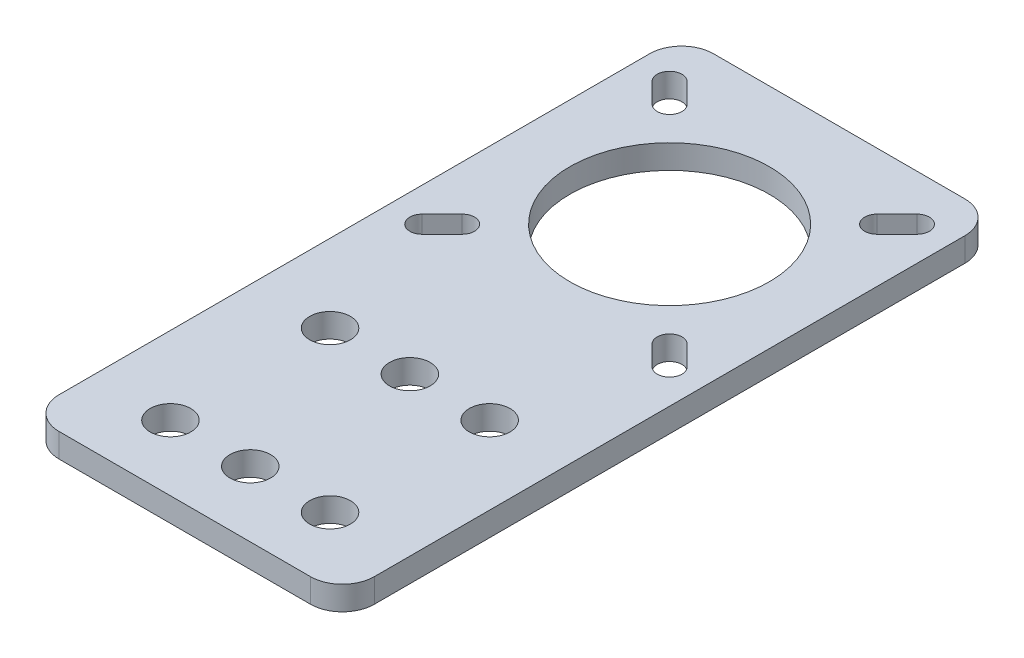
ISO-10303-21;
HEADER;
FILE_DESCRIPTION(('STEP AP214'),'2;1');
FILE_NAME('part.step','',(''),(''),'','','');
FILE_SCHEMA(('AUTOMOTIVE_DESIGN { 1 0 10303 214 1 1 1 1 }'));
ENDSEC;
DATA;
#1=APPLICATION_CONTEXT('core data for automotive mechanical design processes');
#2=APPLICATION_PROTOCOL_DEFINITION('international standard','automotive_design',2000,#1);
#3=PRODUCT_CONTEXT('',#1,'mechanical');
#4=PRODUCT('Part','Part','',(#3));
#5=PRODUCT_RELATED_PRODUCT_CATEGORY('part','',(#4));
#6=PRODUCT_DEFINITION_FORMATION('','',#4);
#7=PRODUCT_DEFINITION_CONTEXT('part definition',#1,'design');
#8=PRODUCT_DEFINITION('design','',#6,#7);
#9=PRODUCT_DEFINITION_SHAPE('','',#8);
#10=(LENGTH_UNIT() NAMED_UNIT(*) SI_UNIT(.MILLI.,.METRE.));
#11=(NAMED_UNIT(*) PLANE_ANGLE_UNIT() SI_UNIT($,.RADIAN.));
#12=(NAMED_UNIT(*) SI_UNIT($,.STERADIAN.) SOLID_ANGLE_UNIT());
#13=UNCERTAINTY_MEASURE_WITH_UNIT(LENGTH_MEASURE(1.E-05),#10,'distance_accuracy_value','');
#14=(GEOMETRIC_REPRESENTATION_CONTEXT(3) GLOBAL_UNCERTAINTY_ASSIGNED_CONTEXT((#13)) GLOBAL_UNIT_ASSIGNED_CONTEXT((#10,
#11,#12)) REPRESENTATION_CONTEXT('',''));
#15=CARTESIAN_POINT('',(0.,0.,0.));
#16=DIRECTION('',(0.,0.,1.));
#17=DIRECTION('',(1.,0.,0.));
#18=AXIS2_PLACEMENT_3D('',#15,#16,#17);
#19=CARTESIAN_POINT('',(0.,3.,0.));
#20=DIRECTION('',(0.,-1.,0.));
#21=DIRECTION('',(0.,0.,-1.));
#22=AXIS2_PLACEMENT_3D('',#19,#20,#21);
#23=PLANE('',#22);
#24=CARTESIAN_POINT('',(0.,3.,32.8));
#25=DIRECTION('',(0.,1.,0.));
#26=DIRECTION('',(0.,0.,1.));
#27=AXIS2_PLACEMENT_3D('',#24,#25,#26);
#28=CIRCLE('',#27,2.55);
#29=CARTESIAN_POINT('',(0.,3.,35.35));
#30=VERTEX_POINT('',#29);
#31=EDGE_CURVE('E376',#30,#30,#28,.T.);
#32=ORIENTED_EDGE('',*,*,#31,.F.);
#33=EDGE_LOOP('',(#32));
#34=FACE_BOUND('',#33,.T.);
#35=CARTESIAN_POINT('',(-10.,3.,32.8));
#36=DIRECTION('',(0.,1.,0.));
#37=DIRECTION('',(0.,0.,1.));
#38=AXIS2_PLACEMENT_3D('',#35,#36,#37);
#39=CIRCLE('',#38,2.55);
#40=CARTESIAN_POINT('',(-10.,3.,35.35));
#41=VERTEX_POINT('',#40);
#42=EDGE_CURVE('E370',#41,#41,#39,.T.);
#43=ORIENTED_EDGE('',*,*,#42,.F.);
#44=EDGE_LOOP('',(#43));
#45=FACE_BOUND('',#44,.T.);
#46=CARTESIAN_POINT('',(0.,3.,12.8));
#47=DIRECTION('',(0.,1.,0.));
#48=DIRECTION('',(0.,0.,1.));
#49=AXIS2_PLACEMENT_3D('',#46,#47,#48);
#50=CIRCLE('',#49,2.55);
#51=CARTESIAN_POINT('',(0.,3.,15.35));
#52=VERTEX_POINT('',#51);
#53=EDGE_CURVE('E357',#52,#52,#50,.T.);
#54=ORIENTED_EDGE('',*,*,#53,.F.);
#55=EDGE_LOOP('',(#54));
#56=FACE_BOUND('',#55,.T.);
#57=DIRECTION('',(0.707106781186547,0.,0.707106781186548));
#58=VECTOR('',#57,1.);
#59=CARTESIAN_POINT('',(8.77898448916083,3.,-8.77898448916081));
#60=LINE('',#59,#58);
#61=CARTESIAN_POINT('',(-16.5960155108391,3.,-34.1539844891608));
#62=VERTEX_POINT('',#61);
#63=CARTESIAN_POINT('',(-14.0960155108391,3.,-31.6539844891608));
#64=VERTEX_POINT('',#63);
#65=EDGE_CURVE('E438',#62,#64,#60,.T.);
#66=ORIENTED_EDGE('',*,*,#65,.F.);
#67=CARTESIAN_POINT('',(-15.5,3.,-35.25));
#68=DIRECTION('',(0.,1.,0.));
#69=DIRECTION('',(0.,0.,1.));
#70=AXIS2_PLACEMENT_3D('',#67,#68,#69);
#71=CIRCLE('',#70,1.55);
#72=CARTESIAN_POINT('',(-14.4039844891609,3.,-36.3460155108391));
#73=VERTEX_POINT('',#72);
#74=EDGE_CURVE('E441',#73,#62,#71,.T.);
#75=ORIENTED_EDGE('',*,*,#74,.F.);
#76=DIRECTION('',(0.707106781186547,0.,0.707106781186549));
#77=VECTOR('',#76,1.);
#78=CARTESIAN_POINT('',(10.9710155108391,3.,-10.9710155108391));
#79=LINE('',#78,#77);
#80=CARTESIAN_POINT('',(-11.9039844891609,3.,-33.8460155108391));
#81=VERTEX_POINT('',#80);
#82=EDGE_CURVE('E431',#73,#81,#79,.T.);
#83=ORIENTED_EDGE('',*,*,#82,.T.);
#84=CARTESIAN_POINT('',(-13.,3.,-32.75));
#85=DIRECTION('',(0.,1.,0.));
#86=DIRECTION('',(0.,0.,1.));
#87=AXIS2_PLACEMENT_3D('',#84,#85,#86);
#88=CIRCLE('',#87,1.55);
#89=EDGE_CURVE('E434',#64,#81,#88,.T.);
#90=ORIENTED_EDGE('',*,*,#89,.F.);
#91=EDGE_LOOP('',(#66,#75,#83,#90));
#92=FACE_BOUND('',#91,.T.);
#93=DIRECTION('',(0.707106781186548,0.,-0.707106781186548));
#94=VECTOR('',#93,1.);
#95=CARTESIAN_POINT('',(-8.77898448916085,3.,-8.77898448916085));
#96=LINE('',#95,#94);
#97=CARTESIAN_POINT('',(-14.4039844891608,3.,-3.15398448916087));
#98=VERTEX_POINT('',#97);
#99=CARTESIAN_POINT('',(-11.9039844891609,3.,-5.65398448916085));
#100=VERTEX_POINT('',#99);
#101=EDGE_CURVE('E469',#98,#100,#96,.T.);
#102=ORIENTED_EDGE('',*,*,#101,.F.);
#103=CARTESIAN_POINT('',(-15.5,3.,-4.25000000000001));
#104=DIRECTION('',(0.,1.,0.));
#105=DIRECTION('',(0.,0.,1.));
#106=AXIS2_PLACEMENT_3D('',#103,#104,#105);
#107=CIRCLE('',#106,1.55);
#108=CARTESIAN_POINT('',(-16.5960155108392,3.,-5.34601551083915));
#109=VERTEX_POINT('',#108);
#110=EDGE_CURVE('E430',#109,#98,#107,.T.);
#111=ORIENTED_EDGE('',*,*,#110,.F.);
#112=DIRECTION('',(0.707106781186548,0.,-0.707106781186547));
#113=VECTOR('',#112,1.);
#114=CARTESIAN_POINT('',(-10.9710155108392,3.,-10.9710155108392));
#115=LINE('',#114,#113);
#116=CARTESIAN_POINT('',(-14.0960155108392,3.,-7.84601551083915));
#117=VERTEX_POINT('',#116);
#118=EDGE_CURVE('E462',#109,#117,#115,.T.);
#119=ORIENTED_EDGE('',*,*,#118,.T.);
#120=CARTESIAN_POINT('',(-13.,3.,-6.75));
#121=DIRECTION('',(0.,1.,0.));
#122=DIRECTION('',(0.,0.,1.));
#123=AXIS2_PLACEMENT_3D('',#120,#121,#122);
#124=CIRCLE('',#123,1.55);
#125=EDGE_CURVE('E465',#100,#117,#124,.T.);
#126=ORIENTED_EDGE('',*,*,#125,.F.);
#127=EDGE_LOOP('',(#102,#111,#119,#126));
#128=FACE_BOUND('',#127,.T.);
#129=CARTESIAN_POINT('',(10.,3.,32.7999999999999));
#130=DIRECTION('',(0.,1.,0.));
#131=DIRECTION('',(0.,0.,1.));
#132=AXIS2_PLACEMENT_3D('',#129,#130,#131);
#133=CIRCLE('',#132,2.55);
#134=CARTESIAN_POINT('',(10.,3.,35.3499999999999));
#135=VERTEX_POINT('',#134);
#136=EDGE_CURVE('E382',#135,#135,#133,.F.);
#137=ORIENTED_EDGE('',*,*,#136,.T.);
#138=EDGE_LOOP('',(#137));
#139=FACE_BOUND('',#138,.T.);
#140=DIRECTION('',(0.,0.,1.));
#141=VECTOR('',#140,1.);
#142=CARTESIAN_POINT('',(-19.75,3.,41.));
#143=LINE('',#142,#141);
#144=CARTESIAN_POINT('',(-19.75,3.,-37.));
#145=VERTEX_POINT('',#144);
#146=CARTESIAN_POINT('',(-19.75,3.,37.));
#147=VERTEX_POINT('',#146);
#148=EDGE_CURVE('E493',#145,#147,#143,.T.);
#149=ORIENTED_EDGE('',*,*,#148,.T.);
#150=CARTESIAN_POINT('',(-15.75,3.,37.));
#151=DIRECTION('',(0.,-1.,0.));
#152=DIRECTION('',(0.,0.,-1.));
#153=AXIS2_PLACEMENT_3D('',#150,#151,#152);
#154=CIRCLE('',#153,4.);
#155=CARTESIAN_POINT('',(-15.75,3.,41.));
#156=VERTEX_POINT('',#155);
#157=EDGE_CURVE('E531',#147,#156,#154,.F.);
#158=ORIENTED_EDGE('',*,*,#157,.T.);
#159=DIRECTION('',(1.,0.,0.));
#160=VECTOR('',#159,1.);
#161=CARTESIAN_POINT('',(-19.75,3.,41.));
#162=LINE('',#161,#160);
#163=CARTESIAN_POINT('',(15.75,3.,41.));
#164=VERTEX_POINT('',#163);
#165=EDGE_CURVE('E496',#156,#164,#162,.T.);
#166=ORIENTED_EDGE('',*,*,#165,.T.);
#167=CARTESIAN_POINT('',(15.75,3.,37.));
#168=DIRECTION('',(0.,-1.,0.));
#169=DIRECTION('',(0.,0.,-1.));
#170=AXIS2_PLACEMENT_3D('',#167,#168,#169);
#171=CIRCLE('',#170,4.);
#172=CARTESIAN_POINT('',(19.75,3.,37.));
#173=VERTEX_POINT('',#172);
#174=EDGE_CURVE('E529',#164,#173,#171,.F.);
#175=ORIENTED_EDGE('',*,*,#174,.T.);
#176=DIRECTION('',(0.,0.,-1.));
#177=VECTOR('',#176,1.);
#178=CARTESIAN_POINT('',(19.75,3.,41.));
#179=LINE('',#178,#177);
#180=CARTESIAN_POINT('',(19.75,3.,-37.));
#181=VERTEX_POINT('',#180);
#182=EDGE_CURVE('E488',#173,#181,#179,.T.);
#183=ORIENTED_EDGE('',*,*,#182,.T.);
#184=CARTESIAN_POINT('',(15.75,3.,-37.));
#185=DIRECTION('',(0.,-1.,0.));
#186=DIRECTION('',(0.,0.,-1.));
#187=AXIS2_PLACEMENT_3D('',#184,#185,#186);
#188=CIRCLE('',#187,4.);
#189=CARTESIAN_POINT('',(15.75,3.,-41.));
#190=VERTEX_POINT('',#189);
#191=EDGE_CURVE('E175',#181,#190,#188,.F.);
#192=ORIENTED_EDGE('',*,*,#191,.T.);
#193=DIRECTION('',(-1.,0.,0.));
#194=VECTOR('',#193,1.);
#195=CARTESIAN_POINT('',(-19.75,3.,-41.));
#196=LINE('',#195,#194);
#197=CARTESIAN_POINT('',(-15.75,3.,-41.));
#198=VERTEX_POINT('',#197);
#199=EDGE_CURVE('E490',#190,#198,#196,.T.);
#200=ORIENTED_EDGE('',*,*,#199,.T.);
#201=CARTESIAN_POINT('',(-15.75,3.,-37.));
#202=DIRECTION('',(0.,-1.,0.));
#203=DIRECTION('',(0.,0.,-1.));
#204=AXIS2_PLACEMENT_3D('',#201,#202,#203);
#205=CIRCLE('',#204,4.);
#206=EDGE_CURVE('E527',#198,#145,#205,.F.);
#207=ORIENTED_EDGE('',*,*,#206,.T.);
#208=EDGE_LOOP('',(#149,#158,#166,#175,#183,#192,#200,#207));
#209=FACE_BOUND('',#208,.T.);
#210=CARTESIAN_POINT('',(0.,3.,-19.75));
#211=DIRECTION('',(0.,1.,0.));
#212=DIRECTION('',(0.,0.,1.));
#213=AXIS2_PLACEMENT_3D('',#210,#211,#212);
#214=CIRCLE('',#213,12.5);
#215=CARTESIAN_POINT('',(0.,3.,-7.25));
#216=VERTEX_POINT('',#215);
#217=EDGE_CURVE('E443',#216,#216,#214,.T.);
#218=ORIENTED_EDGE('',*,*,#217,.F.);
#219=EDGE_LOOP('',(#218));
#220=FACE_BOUND('',#219,.T.);
#221=CARTESIAN_POINT('',(13.,3.,-32.75));
#222=DIRECTION('',(0.,1.,0.));
#223=DIRECTION('',(0.,0.,1.));
#224=AXIS2_PLACEMENT_3D('',#221,#222,#223);
#225=CIRCLE('',#224,1.55);
#226=CARTESIAN_POINT('',(14.0960155108391,3.,-31.6539844891608));
#227=VERTEX_POINT('',#226);
#228=CARTESIAN_POINT('',(11.9039844891609,3.,-33.8460155108392));
#229=VERTEX_POINT('',#228);
#230=EDGE_CURVE('E328',#227,#229,#225,.F.);
#231=ORIENTED_EDGE('',*,*,#230,.T.);
#232=DIRECTION('',(-0.707106781186546,0.,0.707106781186549));
#233=VECTOR('',#232,1.);
#234=CARTESIAN_POINT('',(14.4039844891609,3.,-36.3460155108392));
#235=LINE('',#234,#233);
#236=CARTESIAN_POINT('',(14.4039844891609,3.,-36.3460155108392));
#237=VERTEX_POINT('',#236);
#238=EDGE_CURVE('E338',#237,#229,#235,.T.);
#239=ORIENTED_EDGE('',*,*,#238,.F.);
#240=CARTESIAN_POINT('',(15.5,3.,-35.25));
#241=DIRECTION('',(0.,1.,0.));
#242=DIRECTION('',(0.,0.,1.));
#243=AXIS2_PLACEMENT_3D('',#240,#241,#242);
#244=CIRCLE('',#243,1.55);
#245=CARTESIAN_POINT('',(16.5960155108391,3.,-34.1539844891608));
#246=VERTEX_POINT('',#245);
#247=EDGE_CURVE('E320',#237,#246,#244,.F.);
#248=ORIENTED_EDGE('',*,*,#247,.T.);
#249=DIRECTION('',(-0.707106781186547,0.,0.707106781186548));
#250=VECTOR('',#249,1.);
#251=CARTESIAN_POINT('',(16.5960155108391,3.,-34.1539844891608));
#252=LINE('',#251,#250);
#253=EDGE_CURVE('E332',#246,#227,#252,.T.);
#254=ORIENTED_EDGE('',*,*,#253,.T.);
#255=EDGE_LOOP('',(#231,#239,#248,#254));
#256=FACE_BOUND('',#255,.T.);
#257=CARTESIAN_POINT('',(-10.,3.,12.8));
#258=DIRECTION('',(0.,1.,0.));
#259=DIRECTION('',(0.,0.,1.));
#260=AXIS2_PLACEMENT_3D('',#257,#258,#259);
#261=CIRCLE('',#260,2.55);
#262=CARTESIAN_POINT('',(-10.,3.,15.35));
#263=VERTEX_POINT('',#262);
#264=EDGE_CURVE('E393',#263,#263,#261,.T.);
#265=ORIENTED_EDGE('',*,*,#264,.F.);
#266=EDGE_LOOP('',(#265));
#267=FACE_BOUND('',#266,.T.);
#268=CARTESIAN_POINT('',(13.,3.,-6.75000000000003));
#269=DIRECTION('',(0.,1.,0.));
#270=DIRECTION('',(0.,0.,1.));
#271=AXIS2_PLACEMENT_3D('',#268,#269,#270);
#272=CIRCLE('',#271,1.55);
#273=CARTESIAN_POINT('',(11.9039844891609,3.,-5.65398448916088));
#274=VERTEX_POINT('',#273);
#275=CARTESIAN_POINT('',(14.0960155108392,3.,-7.84601551083918));
#276=VERTEX_POINT('',#275);
#277=EDGE_CURVE('E404',#274,#276,#272,.F.);
#278=ORIENTED_EDGE('',*,*,#277,.T.);
#279=DIRECTION('',(-0.707106781186548,0.,-0.707106781186547));
#280=VECTOR('',#279,1.);
#281=CARTESIAN_POINT('',(10.9710155108392,3.,-10.9710155108392));
#282=LINE('',#281,#280);
#283=CARTESIAN_POINT('',(16.5960155108392,3.,-5.34601551083918));
#284=VERTEX_POINT('',#283);
#285=EDGE_CURVE('E394',#284,#276,#282,.T.);
#286=ORIENTED_EDGE('',*,*,#285,.F.);
#287=CARTESIAN_POINT('',(15.5,3.,-4.25000000000003));
#288=DIRECTION('',(0.,1.,0.));
#289=DIRECTION('',(0.,0.,1.));
#290=AXIS2_PLACEMENT_3D('',#287,#288,#289);
#291=CIRCLE('',#290,1.55);
#292=CARTESIAN_POINT('',(14.4039844891608,3.,-3.1539844891609));
#293=VERTEX_POINT('',#292);
#294=EDGE_CURVE('E397',#284,#293,#291,.F.);
#295=ORIENTED_EDGE('',*,*,#294,.T.);
#296=DIRECTION('',(-0.707106781186548,0.,-0.707106781186548));
#297=VECTOR('',#296,1.);
#298=CARTESIAN_POINT('',(8.77898448916087,3.,-8.77898448916087));
#299=LINE('',#298,#297);
#300=EDGE_CURVE('E401',#293,#274,#299,.T.);
#301=ORIENTED_EDGE('',*,*,#300,.T.);
#302=EDGE_LOOP('',(#278,#286,#295,#301));
#303=FACE_BOUND('',#302,.T.);
#304=CARTESIAN_POINT('',(10.,3.,12.8));
#305=DIRECTION('',(0.,1.,0.));
#306=DIRECTION('',(0.,0.,1.));
#307=AXIS2_PLACEMENT_3D('',#304,#305,#306);
#308=CIRCLE('',#307,2.55);
#309=CARTESIAN_POINT('',(10.,3.,15.35));
#310=VERTEX_POINT('',#309);
#311=EDGE_CURVE('E364',#310,#310,#308,.F.);
#312=ORIENTED_EDGE('',*,*,#311,.T.);
#313=EDGE_LOOP('',(#312));
#314=FACE_BOUND('',#313,.T.);
#315=ADVANCED_FACE('F155',(#34,#45,#56,#92,#128,#139,#209,#220,#256,#267,#303,#314),#23,.F.);
#316=CARTESIAN_POINT('',(0.,0.,0.));
#317=DIRECTION('',(0.,-1.,0.));
#318=DIRECTION('',(0.,0.,-1.));
#319=AXIS2_PLACEMENT_3D('',#316,#317,#318);
#320=PLANE('',#319);
#321=CARTESIAN_POINT('',(0.,0.,32.8));
#322=DIRECTION('',(0.,1.,0.));
#323=DIRECTION('',(0.,0.,1.));
#324=AXIS2_PLACEMENT_3D('',#321,#322,#323);
#325=CIRCLE('',#324,2.55);
#326=CARTESIAN_POINT('',(0.,0.,35.35));
#327=VERTEX_POINT('',#326);
#328=EDGE_CURVE('E379',#327,#327,#325,.T.);
#329=ORIENTED_EDGE('',*,*,#328,.T.);
#330=EDGE_LOOP('',(#329));
#331=FACE_BOUND('',#330,.T.);
#332=CARTESIAN_POINT('',(-10.,0.,32.8));
#333=DIRECTION('',(0.,1.,0.));
#334=DIRECTION('',(0.,0.,1.));
#335=AXIS2_PLACEMENT_3D('',#332,#333,#334);
#336=CIRCLE('',#335,2.55);
#337=CARTESIAN_POINT('',(-10.,0.,35.35));
#338=VERTEX_POINT('',#337);
#339=EDGE_CURVE('E373',#338,#338,#336,.T.);
#340=ORIENTED_EDGE('',*,*,#339,.T.);
#341=EDGE_LOOP('',(#340));
#342=FACE_BOUND('',#341,.T.);
#343=DIRECTION('',(-0.707106781186548,0.,-0.707106781186547));
#344=VECTOR('',#343,1.);
#345=CARTESIAN_POINT('',(10.9710155108392,0.,-10.9710155108392));
#346=LINE('',#345,#344);
#347=CARTESIAN_POINT('',(16.5960155108392,0.,-5.34601551083918));
#348=VERTEX_POINT('',#347);
#349=CARTESIAN_POINT('',(14.0960155108392,0.,-7.84601551083918));
#350=VERTEX_POINT('',#349);
#351=EDGE_CURVE('E386',#348,#350,#346,.T.);
#352=ORIENTED_EDGE('',*,*,#351,.T.);
#353=CARTESIAN_POINT('',(13.,0.,-6.75000000000003));
#354=DIRECTION('',(0.,1.,0.));
#355=DIRECTION('',(0.,0.,1.));
#356=AXIS2_PLACEMENT_3D('',#353,#354,#355);
#357=CIRCLE('',#356,1.55);
#358=CARTESIAN_POINT('',(11.9039844891609,0.,-5.65398448916088));
#359=VERTEX_POINT('',#358);
#360=EDGE_CURVE('E398',#359,#350,#357,.F.);
#361=ORIENTED_EDGE('',*,*,#360,.F.);
#362=DIRECTION('',(-0.707106781186548,0.,-0.707106781186548));
#363=VECTOR('',#362,1.);
#364=CARTESIAN_POINT('',(8.77898448916087,0.,-8.77898448916087));
#365=LINE('',#364,#363);
#366=CARTESIAN_POINT('',(14.4039844891608,0.,-3.1539844891609));
#367=VERTEX_POINT('',#366);
#368=EDGE_CURVE('E413',#367,#359,#365,.T.);
#369=ORIENTED_EDGE('',*,*,#368,.F.);
#370=CARTESIAN_POINT('',(15.5,0.,-4.25000000000003));
#371=DIRECTION('',(0.,1.,0.));
#372=DIRECTION('',(0.,0.,1.));
#373=AXIS2_PLACEMENT_3D('',#370,#371,#372);
#374=CIRCLE('',#373,1.55);
#375=EDGE_CURVE('E410',#348,#367,#374,.F.);
#376=ORIENTED_EDGE('',*,*,#375,.F.);
#377=EDGE_LOOP('',(#352,#361,#369,#376));
#378=FACE_BOUND('',#377,.T.);
#379=CARTESIAN_POINT('',(10.,0.,32.7999999999999));
#380=DIRECTION('',(0.,1.,0.));
#381=DIRECTION('',(0.,0.,1.));
#382=AXIS2_PLACEMENT_3D('',#379,#380,#381);
#383=CIRCLE('',#382,2.55);
#384=CARTESIAN_POINT('',(10.,0.,35.3499999999999));
#385=VERTEX_POINT('',#384);
#386=EDGE_CURVE('E337',#385,#385,#383,.F.);
#387=ORIENTED_EDGE('',*,*,#386,.F.);
#388=EDGE_LOOP('',(#387));
#389=FACE_BOUND('',#388,.T.);
#390=DIRECTION('',(-0.707106781186546,0.,0.707106781186549));
#391=VECTOR('',#390,1.);
#392=CARTESIAN_POINT('',(14.4039844891609,0.,-36.3460155108392));
#393=LINE('',#392,#391);
#394=CARTESIAN_POINT('',(14.4039844891609,0.,-36.3460155108392));
#395=VERTEX_POINT('',#394);
#396=CARTESIAN_POINT('',(11.9039844891609,0.,-33.8460155108392));
#397=VERTEX_POINT('',#396);
#398=EDGE_CURVE('E342',#395,#397,#393,.T.);
#399=ORIENTED_EDGE('',*,*,#398,.T.);
#400=CARTESIAN_POINT('',(13.,0.,-32.75));
#401=DIRECTION('',(0.,1.,0.));
#402=DIRECTION('',(0.,0.,1.));
#403=AXIS2_PLACEMENT_3D('',#400,#401,#402);
#404=CIRCLE('',#403,1.55);
#405=CARTESIAN_POINT('',(14.0960155108391,0.,-31.6539844891608));
#406=VERTEX_POINT('',#405);
#407=EDGE_CURVE('E351',#406,#397,#404,.F.);
#408=ORIENTED_EDGE('',*,*,#407,.F.);
#409=DIRECTION('',(-0.707106781186547,0.,0.707106781186548));
#410=VECTOR('',#409,1.);
#411=CARTESIAN_POINT('',(16.5960155108391,0.,-34.1539844891608));
#412=LINE('',#411,#410);
#413=CARTESIAN_POINT('',(16.5960155108391,0.,-34.1539844891608));
#414=VERTEX_POINT('',#413);
#415=EDGE_CURVE('E345',#414,#406,#412,.T.);
#416=ORIENTED_EDGE('',*,*,#415,.F.);
#417=CARTESIAN_POINT('',(15.5,0.,-35.25));
#418=DIRECTION('',(0.,1.,0.));
#419=DIRECTION('',(0.,0.,1.));
#420=AXIS2_PLACEMENT_3D('',#417,#418,#419);
#421=CIRCLE('',#420,1.55);
#422=EDGE_CURVE('E323',#395,#414,#421,.F.);
#423=ORIENTED_EDGE('',*,*,#422,.F.);
#424=EDGE_LOOP('',(#399,#408,#416,#423));
#425=FACE_BOUND('',#424,.T.);
#426=CARTESIAN_POINT('',(0.,0.,-19.75));
#427=DIRECTION('',(0.,1.,0.));
#428=DIRECTION('',(0.,0.,1.));
#429=AXIS2_PLACEMENT_3D('',#426,#427,#428);
#430=CIRCLE('',#429,12.5);
#431=CARTESIAN_POINT('',(0.,0.,-7.25));
#432=VERTEX_POINT('',#431);
#433=EDGE_CURVE('E482',#432,#432,#430,.T.);
#434=ORIENTED_EDGE('',*,*,#433,.T.);
#435=EDGE_LOOP('',(#434));
#436=FACE_BOUND('',#435,.T.);
#437=DIRECTION('',(1.,0.,0.));
#438=VECTOR('',#437,1.);
#439=CARTESIAN_POINT('',(-19.75,0.,41.));
#440=LINE('',#439,#438);
#441=CARTESIAN_POINT('',(-15.75,0.,41.));
#442=VERTEX_POINT('',#441);
#443=CARTESIAN_POINT('',(15.75,0.,41.));
#444=VERTEX_POINT('',#443);
#445=EDGE_CURVE('E491',#442,#444,#440,.T.);
#446=ORIENTED_EDGE('',*,*,#445,.F.);
#447=CARTESIAN_POINT('',(-15.75,0.,37.));
#448=DIRECTION('',(0.,-1.,0.));
#449=DIRECTION('',(0.,0.,-1.));
#450=AXIS2_PLACEMENT_3D('',#447,#448,#449);
#451=CIRCLE('',#450,4.);
#452=CARTESIAN_POINT('',(-19.75,0.,37.));
#453=VERTEX_POINT('',#452);
#454=EDGE_CURVE('E519',#442,#453,#451,.T.);
#455=ORIENTED_EDGE('',*,*,#454,.T.);
#456=DIRECTION('',(0.,0.,1.));
#457=VECTOR('',#456,1.);
#458=CARTESIAN_POINT('',(-19.75,0.,41.));
#459=LINE('',#458,#457);
#460=CARTESIAN_POINT('',(-19.75,0.,-37.));
#461=VERTEX_POINT('',#460);
#462=EDGE_CURVE('E504',#461,#453,#459,.T.);
#463=ORIENTED_EDGE('',*,*,#462,.F.);
#464=CARTESIAN_POINT('',(-15.75,0.,-37.));
#465=DIRECTION('',(0.,-1.,0.));
#466=DIRECTION('',(0.,0.,-1.));
#467=AXIS2_PLACEMENT_3D('',#464,#465,#466);
#468=CIRCLE('',#467,4.);
#469=CARTESIAN_POINT('',(-15.75,0.,-41.));
#470=VERTEX_POINT('',#469);
#471=EDGE_CURVE('E515',#461,#470,#468,.T.);
#472=ORIENTED_EDGE('',*,*,#471,.T.);
#473=DIRECTION('',(-1.,0.,0.));
#474=VECTOR('',#473,1.);
#475=CARTESIAN_POINT('',(-19.75,0.,-41.));
#476=LINE('',#475,#474);
#477=CARTESIAN_POINT('',(15.75,0.,-41.));
#478=VERTEX_POINT('',#477);
#479=EDGE_CURVE('E502',#478,#470,#476,.T.);
#480=ORIENTED_EDGE('',*,*,#479,.F.);
#481=CARTESIAN_POINT('',(15.75,0.,-37.));
#482=DIRECTION('',(0.,-1.,0.));
#483=DIRECTION('',(0.,0.,-1.));
#484=AXIS2_PLACEMENT_3D('',#481,#482,#483);
#485=CIRCLE('',#484,4.);
#486=CARTESIAN_POINT('',(19.75,0.,-37.));
#487=VERTEX_POINT('',#486);
#488=EDGE_CURVE('E513',#478,#487,#485,.T.);
#489=ORIENTED_EDGE('',*,*,#488,.T.);
#490=DIRECTION('',(0.,0.,-1.));
#491=VECTOR('',#490,1.);
#492=CARTESIAN_POINT('',(19.75,0.,41.));
#493=LINE('',#492,#491);
#494=CARTESIAN_POINT('',(19.75,0.,37.));
#495=VERTEX_POINT('',#494);
#496=EDGE_CURVE('E485',#495,#487,#493,.T.);
#497=ORIENTED_EDGE('',*,*,#496,.F.);
#498=CARTESIAN_POINT('',(15.75,0.,37.));
#499=DIRECTION('',(0.,-1.,0.));
#500=DIRECTION('',(0.,0.,-1.));
#501=AXIS2_PLACEMENT_3D('',#498,#499,#500);
#502=CIRCLE('',#501,4.);
#503=EDGE_CURVE('E517',#495,#444,#502,.T.);
#504=ORIENTED_EDGE('',*,*,#503,.T.);
#505=EDGE_LOOP('',(#446,#455,#463,#472,#480,#489,#497,#504));
#506=FACE_BOUND('',#505,.T.);
#507=CARTESIAN_POINT('',(-10.,0.,12.8));
#508=DIRECTION('',(0.,1.,0.));
#509=DIRECTION('',(0.,0.,1.));
#510=AXIS2_PLACEMENT_3D('',#507,#508,#509);
#511=CIRCLE('',#510,2.55);
#512=CARTESIAN_POINT('',(-10.,0.,15.35));
#513=VERTEX_POINT('',#512);
#514=EDGE_CURVE('E360',#513,#513,#511,.T.);
#515=ORIENTED_EDGE('',*,*,#514,.T.);
#516=EDGE_LOOP('',(#515));
#517=FACE_BOUND('',#516,.T.);
#518=CARTESIAN_POINT('',(-15.5,0.,-4.25000000000001));
#519=DIRECTION('',(0.,1.,0.));
#520=DIRECTION('',(0.,0.,1.));
#521=AXIS2_PLACEMENT_3D('',#518,#519,#520);
#522=CIRCLE('',#521,1.55);
#523=CARTESIAN_POINT('',(-16.5960155108392,0.,-5.34601551083915));
#524=VERTEX_POINT('',#523);
#525=CARTESIAN_POINT('',(-14.4039844891608,0.,-3.15398448916087));
#526=VERTEX_POINT('',#525);
#527=EDGE_CURVE('E466',#524,#526,#522,.T.);
#528=ORIENTED_EDGE('',*,*,#527,.T.);
#529=DIRECTION('',(0.707106781186548,0.,-0.707106781186548));
#530=VECTOR('',#529,1.);
#531=CARTESIAN_POINT('',(-8.77898448916085,0.,-8.77898448916085));
#532=LINE('',#531,#530);
#533=CARTESIAN_POINT('',(-11.9039844891609,0.,-5.65398448916085));
#534=VERTEX_POINT('',#533);
#535=EDGE_CURVE('E477',#526,#534,#532,.T.);
#536=ORIENTED_EDGE('',*,*,#535,.T.);
#537=CARTESIAN_POINT('',(-13.,0.,-6.75));
#538=DIRECTION('',(0.,1.,0.));
#539=DIRECTION('',(0.,0.,1.));
#540=AXIS2_PLACEMENT_3D('',#537,#538,#539);
#541=CIRCLE('',#540,1.55);
#542=CARTESIAN_POINT('',(-14.0960155108392,0.,-7.84601551083915));
#543=VERTEX_POINT('',#542);
#544=EDGE_CURVE('E474',#534,#543,#541,.T.);
#545=ORIENTED_EDGE('',*,*,#544,.T.);
#546=DIRECTION('',(0.707106781186548,0.,-0.707106781186547));
#547=VECTOR('',#546,1.);
#548=CARTESIAN_POINT('',(-10.9710155108392,0.,-10.9710155108392));
#549=LINE('',#548,#547);
#550=EDGE_CURVE('E456',#524,#543,#549,.T.);
#551=ORIENTED_EDGE('',*,*,#550,.F.);
#552=EDGE_LOOP('',(#528,#536,#545,#551));
#553=FACE_BOUND('',#552,.T.);
#554=CARTESIAN_POINT('',(-15.5,0.,-35.25));
#555=DIRECTION('',(0.,1.,0.));
#556=DIRECTION('',(0.,0.,1.));
#557=AXIS2_PLACEMENT_3D('',#554,#555,#556);
#558=CIRCLE('',#557,1.55);
#559=CARTESIAN_POINT('',(-14.4039844891609,0.,-36.3460155108391));
#560=VERTEX_POINT('',#559);
#561=CARTESIAN_POINT('',(-16.5960155108391,0.,-34.1539844891608));
#562=VERTEX_POINT('',#561);
#563=EDGE_CURVE('E435',#560,#562,#558,.T.);
#564=ORIENTED_EDGE('',*,*,#563,.T.);
#565=DIRECTION('',(0.707106781186547,0.,0.707106781186548));
#566=VECTOR('',#565,1.);
#567=CARTESIAN_POINT('',(8.77898448916083,0.,-8.77898448916081));
#568=LINE('',#567,#566);
#569=CARTESIAN_POINT('',(-14.0960155108391,0.,-31.6539844891608));
#570=VERTEX_POINT('',#569);
#571=EDGE_CURVE('E448',#562,#570,#568,.T.);
#572=ORIENTED_EDGE('',*,*,#571,.T.);
#573=CARTESIAN_POINT('',(-13.,0.,-32.75));
#574=DIRECTION('',(0.,1.,0.));
#575=DIRECTION('',(0.,0.,1.));
#576=AXIS2_PLACEMENT_3D('',#573,#574,#575);
#577=CIRCLE('',#576,1.55);
#578=CARTESIAN_POINT('',(-11.9039844891609,0.,-33.8460155108391));
#579=VERTEX_POINT('',#578);
#580=EDGE_CURVE('E445',#570,#579,#577,.T.);
#581=ORIENTED_EDGE('',*,*,#580,.T.);
#582=DIRECTION('',(0.707106781186547,0.,0.707106781186549));
#583=VECTOR('',#582,1.);
#584=CARTESIAN_POINT('',(10.9710155108391,0.,-10.9710155108391));
#585=LINE('',#584,#583);
#586=EDGE_CURVE('E423',#560,#579,#585,.T.);
#587=ORIENTED_EDGE('',*,*,#586,.F.);
#588=EDGE_LOOP('',(#564,#572,#581,#587));
#589=FACE_BOUND('',#588,.T.);
#590=CARTESIAN_POINT('',(0.,0.,12.8));
#591=DIRECTION('',(0.,1.,0.));
#592=DIRECTION('',(0.,0.,1.));
#593=AXIS2_PLACEMENT_3D('',#590,#591,#592);
#594=CIRCLE('',#593,2.55);
#595=CARTESIAN_POINT('',(0.,0.,15.35));
#596=VERTEX_POINT('',#595);
#597=EDGE_CURVE('E361',#596,#596,#594,.T.);
#598=ORIENTED_EDGE('',*,*,#597,.T.);
#599=EDGE_LOOP('',(#598));
#600=FACE_BOUND('',#599,.T.);
#601=CARTESIAN_POINT('',(10.,0.,12.8));
#602=DIRECTION('',(0.,1.,0.));
#603=DIRECTION('',(0.,0.,1.));
#604=AXIS2_PLACEMENT_3D('',#601,#602,#603);
#605=CIRCLE('',#604,2.55);
#606=CARTESIAN_POINT('',(10.,0.,15.35));
#607=VERTEX_POINT('',#606);
#608=EDGE_CURVE('E367',#607,#607,#605,.F.);
#609=ORIENTED_EDGE('',*,*,#608,.F.);
#610=EDGE_LOOP('',(#609));
#611=FACE_BOUND('',#610,.T.);
#612=ADVANCED_FACE('F544',(#331,#342,#378,#389,#425,#436,#506,#517,#553,#589,#600,#611),#320,.T.);
#613=CARTESIAN_POINT('',(19.75,3.,41.));
#614=DIRECTION('',(-1.,0.,0.));
#615=DIRECTION('',(0.,0.,1.));
#616=AXIS2_PLACEMENT_3D('',#613,#614,#615);
#617=PLANE('',#616);
#618=ORIENTED_EDGE('',*,*,#182,.F.);
#619=DIRECTION('',(0.,-1.,0.));
#620=VECTOR('',#619,1.);
#621=CARTESIAN_POINT('',(19.75,3.,37.));
#622=LINE('',#621,#620);
#623=EDGE_CURVE('E535',#173,#495,#622,.T.);
#624=ORIENTED_EDGE('',*,*,#623,.T.);
#625=ORIENTED_EDGE('',*,*,#496,.T.);
#626=DIRECTION('',(0.,-1.,0.));
#627=VECTOR('',#626,1.);
#628=CARTESIAN_POINT('',(19.75,3.,-37.));
#629=LINE('',#628,#627);
#630=EDGE_CURVE('E533',#487,#181,#629,.F.);
#631=ORIENTED_EDGE('',*,*,#630,.T.);
#632=EDGE_LOOP('',(#618,#624,#625,#631));
#633=FACE_BOUND('',#632,.T.);
#634=ADVANCED_FACE('F571',(#633),#617,.F.);
#635=CARTESIAN_POINT('',(-19.75,3.,-41.));
#636=DIRECTION('',(0.,0.,1.));
#637=DIRECTION('',(1.,0.,0.));
#638=AXIS2_PLACEMENT_3D('',#635,#636,#637);
#639=PLANE('',#638);
#640=ORIENTED_EDGE('',*,*,#479,.T.);
#641=DIRECTION('',(0.,-1.,0.));
#642=VECTOR('',#641,1.);
#643=CARTESIAN_POINT('',(-15.75,3.,-41.));
#644=LINE('',#643,#642);
#645=EDGE_CURVE('E12',#470,#198,#644,.F.);
#646=ORIENTED_EDGE('',*,*,#645,.T.);
#647=ORIENTED_EDGE('',*,*,#199,.F.);
#648=DIRECTION('',(0.,-1.,0.));
#649=VECTOR('',#648,1.);
#650=CARTESIAN_POINT('',(15.75,3.,-41.));
#651=LINE('',#650,#649);
#652=EDGE_CURVE('E163',#190,#478,#651,.T.);
#653=ORIENTED_EDGE('',*,*,#652,.T.);
#654=EDGE_LOOP('',(#640,#646,#647,#653));
#655=FACE_BOUND('',#654,.T.);
#656=ADVANCED_FACE('F540',(#655),#639,.F.);
#657=CARTESIAN_POINT('',(-19.75,3.,41.));
#658=DIRECTION('',(1.,0.,0.));
#659=DIRECTION('',(0.,0.,-1.));
#660=AXIS2_PLACEMENT_3D('',#657,#658,#659);
#661=PLANE('',#660);
#662=ORIENTED_EDGE('',*,*,#462,.T.);
#663=DIRECTION('',(0.,-1.,0.));
#664=VECTOR('',#663,1.);
#665=CARTESIAN_POINT('',(-19.75,3.,37.));
#666=LINE('',#665,#664);
#667=EDGE_CURVE('E524',#453,#147,#666,.F.);
#668=ORIENTED_EDGE('',*,*,#667,.T.);
#669=ORIENTED_EDGE('',*,*,#148,.F.);
#670=DIRECTION('',(0.,-1.,0.));
#671=VECTOR('',#670,1.);
#672=CARTESIAN_POINT('',(-19.75,3.,-37.));
#673=LINE('',#672,#671);
#674=EDGE_CURVE('E521',#145,#461,#673,.T.);
#675=ORIENTED_EDGE('',*,*,#674,.T.);
#676=EDGE_LOOP('',(#662,#668,#669,#675));
#677=FACE_BOUND('',#676,.T.);
#678=ADVANCED_FACE('F554',(#677),#661,.F.);
#679=CARTESIAN_POINT('',(-19.75,3.,41.));
#680=DIRECTION('',(0.,0.,-1.));
#681=DIRECTION('',(-1.,0.,0.));
#682=AXIS2_PLACEMENT_3D('',#679,#680,#681);
#683=PLANE('',#682);
#684=ORIENTED_EDGE('',*,*,#165,.F.);
#685=DIRECTION('',(0.,-1.,0.));
#686=VECTOR('',#685,1.);
#687=CARTESIAN_POINT('',(-15.75,3.,41.));
#688=LINE('',#687,#686);
#689=EDGE_CURVE('E510',#156,#442,#688,.T.);
#690=ORIENTED_EDGE('',*,*,#689,.T.);
#691=ORIENTED_EDGE('',*,*,#445,.T.);
#692=DIRECTION('',(0.,-1.,0.));
#693=VECTOR('',#692,1.);
#694=CARTESIAN_POINT('',(15.75,3.,41.));
#695=LINE('',#694,#693);
#696=EDGE_CURVE('E499',#444,#164,#695,.F.);
#697=ORIENTED_EDGE('',*,*,#696,.T.);
#698=EDGE_LOOP('',(#684,#690,#691,#697));
#699=FACE_BOUND('',#698,.T.);
#700=ADVANCED_FACE('F563',(#699),#683,.F.);
#701=CARTESIAN_POINT('',(0.,0.,-19.75));
#702=DIRECTION('',(0.,1.,0.));
#703=DIRECTION('',(0.,0.,1.));
#704=AXIS2_PLACEMENT_3D('',#701,#702,#703);
#705=CYLINDRICAL_SURFACE('',#704,12.5);
#706=ORIENTED_EDGE('',*,*,#433,.F.);
#707=EDGE_LOOP('',(#706));
#708=FACE_BOUND('',#707,.T.);
#709=ORIENTED_EDGE('',*,*,#217,.T.);
#710=EDGE_LOOP('',(#709));
#711=FACE_BOUND('',#710,.T.);
#712=ADVANCED_FACE('F588',(#708,#711),#705,.F.);
#713=CARTESIAN_POINT('',(13.,0.,-32.75));
#714=DIRECTION('',(0.,1.,0.));
#715=DIRECTION('',(0.,0.,1.));
#716=AXIS2_PLACEMENT_3D('',#713,#714,#715);
#717=CYLINDRICAL_SURFACE('',#716,1.55);
#718=ORIENTED_EDGE('',*,*,#230,.F.);
#719=DIRECTION('',(0.,1.,0.));
#720=VECTOR('',#719,1.);
#721=CARTESIAN_POINT('',(14.0960155108391,0.,-31.6539844891608));
#722=LINE('',#721,#720);
#723=EDGE_CURVE('E334',#406,#227,#722,.T.);
#724=ORIENTED_EDGE('',*,*,#723,.F.);
#725=ORIENTED_EDGE('',*,*,#407,.T.);
#726=DIRECTION('',(0.,1.,0.));
#727=VECTOR('',#726,1.);
#728=CARTESIAN_POINT('',(11.9039844891609,0.,-33.8460155108392));
#729=LINE('',#728,#727);
#730=EDGE_CURVE('E352',#397,#229,#729,.T.);
#731=ORIENTED_EDGE('',*,*,#730,.T.);
#732=EDGE_LOOP('',(#718,#724,#725,#731));
#733=FACE_BOUND('',#732,.T.);
#734=ADVANCED_FACE('F786',(#733),#717,.F.);
#735=CARTESIAN_POINT('',(15.5,0.,-35.25));
#736=DIRECTION('',(0.,1.,0.));
#737=DIRECTION('',(0.,0.,1.));
#738=AXIS2_PLACEMENT_3D('',#735,#736,#737);
#739=CYLINDRICAL_SURFACE('',#738,1.55);
#740=ORIENTED_EDGE('',*,*,#247,.F.);
#741=DIRECTION('',(0.,1.,0.));
#742=VECTOR('',#741,1.);
#743=CARTESIAN_POINT('',(14.4039844891609,0.,-36.3460155108392));
#744=LINE('',#743,#742);
#745=EDGE_CURVE('E327',#395,#237,#744,.T.);
#746=ORIENTED_EDGE('',*,*,#745,.F.);
#747=ORIENTED_EDGE('',*,*,#422,.T.);
#748=DIRECTION('',(0.,1.,0.));
#749=VECTOR('',#748,1.);
#750=CARTESIAN_POINT('',(16.5960155108391,0.,-34.1539844891608));
#751=LINE('',#750,#749);
#752=EDGE_CURVE('E316',#414,#246,#751,.T.);
#753=ORIENTED_EDGE('',*,*,#752,.T.);
#754=EDGE_LOOP('',(#740,#746,#747,#753));
#755=FACE_BOUND('',#754,.T.);
#756=ADVANCED_FACE('F318',(#755),#739,.F.);
#757=CARTESIAN_POINT('',(14.4039844891609,0.,-36.3460155108392));
#758=DIRECTION('',(-0.707106781186549,0.,-0.707106781186546));
#759=DIRECTION('',(-0.707106781186546,0.,0.707106781186549));
#760=AXIS2_PLACEMENT_3D('',#757,#758,#759);
#761=PLANE('',#760);
#762=ORIENTED_EDGE('',*,*,#238,.T.);
#763=ORIENTED_EDGE('',*,*,#730,.F.);
#764=ORIENTED_EDGE('',*,*,#398,.F.);
#765=ORIENTED_EDGE('',*,*,#745,.T.);
#766=EDGE_LOOP('',(#762,#763,#764,#765));
#767=FACE_BOUND('',#766,.T.);
#768=ADVANCED_FACE('F793',(#767),#761,.F.);
#769=CARTESIAN_POINT('',(16.5960155108391,0.,-34.1539844891608));
#770=DIRECTION('',(-0.707106781186548,0.,-0.707106781186547));
#771=DIRECTION('',(-0.707106781186547,0.,0.707106781186548));
#772=AXIS2_PLACEMENT_3D('',#769,#770,#771);
#773=PLANE('',#772);
#774=ORIENTED_EDGE('',*,*,#253,.F.);
#775=ORIENTED_EDGE('',*,*,#752,.F.);
#776=ORIENTED_EDGE('',*,*,#415,.T.);
#777=ORIENTED_EDGE('',*,*,#723,.T.);
#778=EDGE_LOOP('',(#774,#775,#776,#777));
#779=FACE_BOUND('',#778,.T.);
#780=ADVANCED_FACE('F333',(#779),#773,.T.);
#781=CARTESIAN_POINT('',(10.,0.,32.7999999999999));
#782=DIRECTION('',(0.,1.,0.));
#783=DIRECTION('',(0.,0.,1.));
#784=AXIS2_PLACEMENT_3D('',#781,#782,#783);
#785=CYLINDRICAL_SURFACE('',#784,2.55);
#786=ORIENTED_EDGE('',*,*,#386,.T.);
#787=EDGE_LOOP('',(#786));
#788=FACE_BOUND('',#787,.T.);
#789=ORIENTED_EDGE('',*,*,#136,.F.);
#790=EDGE_LOOP('',(#789));
#791=FACE_BOUND('',#790,.T.);
#792=ADVANCED_FACE('F775',(#788,#791),#785,.F.);
#793=CARTESIAN_POINT('',(-10.,0.,12.8));
#794=DIRECTION('',(0.,1.,0.));
#795=DIRECTION('',(0.,0.,1.));
#796=AXIS2_PLACEMENT_3D('',#793,#794,#795);
#797=CYLINDRICAL_SURFACE('',#796,2.55);
#798=ORIENTED_EDGE('',*,*,#514,.F.);
#799=EDGE_LOOP('',(#798));
#800=FACE_BOUND('',#799,.T.);
#801=ORIENTED_EDGE('',*,*,#264,.T.);
#802=EDGE_LOOP('',(#801));
#803=FACE_BOUND('',#802,.T.);
#804=ADVANCED_FACE('F766',(#800,#803),#797,.F.);
#805=CARTESIAN_POINT('',(13.,0.,-6.75000000000003));
#806=DIRECTION('',(0.,1.,0.));
#807=DIRECTION('',(0.,0.,1.));
#808=AXIS2_PLACEMENT_3D('',#805,#806,#807);
#809=CYLINDRICAL_SURFACE('',#808,1.55);
#810=ORIENTED_EDGE('',*,*,#277,.F.);
#811=DIRECTION('',(0.,1.,0.));
#812=VECTOR('',#811,1.);
#813=CARTESIAN_POINT('',(11.9039844891609,0.,-5.65398448916088));
#814=LINE('',#813,#812);
#815=EDGE_CURVE('E383',#359,#274,#814,.T.);
#816=ORIENTED_EDGE('',*,*,#815,.F.);
#817=ORIENTED_EDGE('',*,*,#360,.T.);
#818=DIRECTION('',(0.,1.,0.));
#819=VECTOR('',#818,1.);
#820=CARTESIAN_POINT('',(14.0960155108392,0.,-7.84601551083918));
#821=LINE('',#820,#819);
#822=EDGE_CURVE('E391',#350,#276,#821,.T.);
#823=ORIENTED_EDGE('',*,*,#822,.T.);
#824=EDGE_LOOP('',(#810,#816,#817,#823));
#825=FACE_BOUND('',#824,.T.);
#826=ADVANCED_FACE('F757',(#825),#809,.F.);
#827=CARTESIAN_POINT('',(10.9710155108392,0.,-10.9710155108392));
#828=DIRECTION('',(0.707106781186547,0.,-0.707106781186548));
#829=DIRECTION('',(-0.707106781186548,0.,-0.707106781186547));
#830=AXIS2_PLACEMENT_3D('',#827,#828,#829);
#831=PLANE('',#830);
#832=ORIENTED_EDGE('',*,*,#285,.T.);
#833=ORIENTED_EDGE('',*,*,#822,.F.);
#834=ORIENTED_EDGE('',*,*,#351,.F.);
#835=DIRECTION('',(0.,1.,0.));
#836=VECTOR('',#835,1.);
#837=CARTESIAN_POINT('',(16.5960155108392,0.,-5.34601551083918));
#838=LINE('',#837,#836);
#839=EDGE_CURVE('E389',#348,#284,#838,.T.);
#840=ORIENTED_EDGE('',*,*,#839,.T.);
#841=EDGE_LOOP('',(#832,#833,#834,#840));
#842=FACE_BOUND('',#841,.T.);
#843=ADVANCED_FACE('F748',(#842),#831,.F.);
#844=CARTESIAN_POINT('',(15.5,0.,-4.25000000000003));
#845=DIRECTION('',(0.,1.,0.));
#846=DIRECTION('',(0.,0.,1.));
#847=AXIS2_PLACEMENT_3D('',#844,#845,#846);
#848=CYLINDRICAL_SURFACE('',#847,1.55);
#849=ORIENTED_EDGE('',*,*,#294,.F.);
#850=ORIENTED_EDGE('',*,*,#839,.F.);
#851=ORIENTED_EDGE('',*,*,#375,.T.);
#852=DIRECTION('',(0.,1.,0.));
#853=VECTOR('',#852,1.);
#854=CARTESIAN_POINT('',(14.4039844891608,0.,-3.1539844891609));
#855=LINE('',#854,#853);
#856=EDGE_CURVE('E387',#367,#293,#855,.T.);
#857=ORIENTED_EDGE('',*,*,#856,.T.);
#858=EDGE_LOOP('',(#849,#850,#851,#857));
#859=FACE_BOUND('',#858,.T.);
#860=ADVANCED_FACE('F739',(#859),#848,.F.);
#861=CARTESIAN_POINT('',(8.77898448916087,0.,-8.77898448916087));
#862=DIRECTION('',(0.707106781186547,0.,-0.707106781186547));
#863=DIRECTION('',(-0.707106781186548,0.,-0.707106781186548));
#864=AXIS2_PLACEMENT_3D('',#861,#862,#863);
#865=PLANE('',#864);
#866=ORIENTED_EDGE('',*,*,#300,.F.);
#867=ORIENTED_EDGE('',*,*,#856,.F.);
#868=ORIENTED_EDGE('',*,*,#368,.T.);
#869=ORIENTED_EDGE('',*,*,#815,.T.);
#870=EDGE_LOOP('',(#866,#867,#868,#869));
#871=FACE_BOUND('',#870,.T.);
#872=ADVANCED_FACE('F730',(#871),#865,.T.);
#873=CARTESIAN_POINT('',(-15.5,0.,-4.25000000000001));
#874=DIRECTION('',(0.,1.,0.));
#875=DIRECTION('',(0.,0.,1.));
#876=AXIS2_PLACEMENT_3D('',#873,#874,#875);
#877=CYLINDRICAL_SURFACE('',#876,1.55);
#878=ORIENTED_EDGE('',*,*,#110,.T.);
#879=DIRECTION('',(0.,1.,0.));
#880=VECTOR('',#879,1.);
#881=CARTESIAN_POINT('',(-14.4039844891608,0.,-3.15398448916087));
#882=LINE('',#881,#880);
#883=EDGE_CURVE('E453',#526,#98,#882,.T.);
#884=ORIENTED_EDGE('',*,*,#883,.F.);
#885=ORIENTED_EDGE('',*,*,#527,.F.);
#886=DIRECTION('',(0.,1.,0.));
#887=VECTOR('',#886,1.);
#888=CARTESIAN_POINT('',(-16.5960155108392,0.,-5.34601551083915));
#889=LINE('',#888,#887);
#890=EDGE_CURVE('E407',#524,#109,#889,.T.);
#891=ORIENTED_EDGE('',*,*,#890,.T.);
#892=EDGE_LOOP('',(#878,#884,#885,#891));
#893=FACE_BOUND('',#892,.T.);
#894=ADVANCED_FACE('F722',(#893),#877,.F.);
#895=CARTESIAN_POINT('',(-10.9710155108392,0.,-10.9710155108392));
#896=DIRECTION('',(0.707106781186547,0.,0.707106781186548));
#897=DIRECTION('',(0.707106781186548,0.,-0.707106781186547));
#898=AXIS2_PLACEMENT_3D('',#895,#896,#897);
#899=PLANE('',#898);
#900=ORIENTED_EDGE('',*,*,#118,.F.);
#901=ORIENTED_EDGE('',*,*,#890,.F.);
#902=ORIENTED_EDGE('',*,*,#550,.T.);
#903=DIRECTION('',(0.,1.,0.));
#904=VECTOR('',#903,1.);
#905=CARTESIAN_POINT('',(-14.0960155108392,0.,-7.84601551083915));
#906=LINE('',#905,#904);
#907=EDGE_CURVE('E459',#543,#117,#906,.T.);
#908=ORIENTED_EDGE('',*,*,#907,.T.);
#909=EDGE_LOOP('',(#900,#901,#902,#908));
#910=FACE_BOUND('',#909,.T.);
#911=ADVANCED_FACE('F713',(#910),#899,.T.);
#912=CARTESIAN_POINT('',(-13.,0.,-6.75));
#913=DIRECTION('',(0.,1.,0.));
#914=DIRECTION('',(0.,0.,1.));
#915=AXIS2_PLACEMENT_3D('',#912,#913,#914);
#916=CYLINDRICAL_SURFACE('',#915,1.55);
#917=ORIENTED_EDGE('',*,*,#125,.T.);
#918=ORIENTED_EDGE('',*,*,#907,.F.);
#919=ORIENTED_EDGE('',*,*,#544,.F.);
#920=DIRECTION('',(0.,1.,0.));
#921=VECTOR('',#920,1.);
#922=CARTESIAN_POINT('',(-11.9039844891609,0.,-5.65398448916085));
#923=LINE('',#922,#921);
#924=EDGE_CURVE('E457',#534,#100,#923,.T.);
#925=ORIENTED_EDGE('',*,*,#924,.T.);
#926=EDGE_LOOP('',(#917,#918,#919,#925));
#927=FACE_BOUND('',#926,.T.);
#928=ADVANCED_FACE('F704',(#927),#916,.F.);
#929=CARTESIAN_POINT('',(-8.77898448916085,0.,-8.77898448916085));
#930=DIRECTION('',(0.707106781186547,0.,0.707106781186547));
#931=DIRECTION('',(0.707106781186548,0.,-0.707106781186548));
#932=AXIS2_PLACEMENT_3D('',#929,#930,#931);
#933=PLANE('',#932);
#934=ORIENTED_EDGE('',*,*,#101,.T.);
#935=ORIENTED_EDGE('',*,*,#924,.F.);
#936=ORIENTED_EDGE('',*,*,#535,.F.);
#937=ORIENTED_EDGE('',*,*,#883,.T.);
#938=EDGE_LOOP('',(#934,#935,#936,#937));
#939=FACE_BOUND('',#938,.T.);
#940=ADVANCED_FACE('F695',(#939),#933,.F.);
#941=CARTESIAN_POINT('',(-15.5,0.,-35.25));
#942=DIRECTION('',(0.,1.,0.));
#943=DIRECTION('',(0.,0.,1.));
#944=AXIS2_PLACEMENT_3D('',#941,#942,#943);
#945=CYLINDRICAL_SURFACE('',#944,1.55);
#946=ORIENTED_EDGE('',*,*,#74,.T.);
#947=DIRECTION('',(0.,1.,0.));
#948=VECTOR('',#947,1.);
#949=CARTESIAN_POINT('',(-16.5960155108391,0.,-34.1539844891608));
#950=LINE('',#949,#948);
#951=EDGE_CURVE('E420',#562,#62,#950,.T.);
#952=ORIENTED_EDGE('',*,*,#951,.F.);
#953=ORIENTED_EDGE('',*,*,#563,.F.);
#954=DIRECTION('',(0.,1.,0.));
#955=VECTOR('',#954,1.);
#956=CARTESIAN_POINT('',(-14.4039844891609,0.,-36.3460155108391));
#957=LINE('',#956,#955);
#958=EDGE_CURVE('E428',#560,#73,#957,.T.);
#959=ORIENTED_EDGE('',*,*,#958,.T.);
#960=EDGE_LOOP('',(#946,#952,#953,#959));
#961=FACE_BOUND('',#960,.T.);
#962=ADVANCED_FACE('F686',(#961),#945,.F.);
#963=CARTESIAN_POINT('',(10.9710155108391,0.,-10.9710155108391));
#964=DIRECTION('',(-0.707106781186548,0.,0.707106781186546));
#965=DIRECTION('',(0.707106781186547,0.,0.707106781186549));
#966=AXIS2_PLACEMENT_3D('',#963,#964,#965);
#967=PLANE('',#966);
#968=ORIENTED_EDGE('',*,*,#82,.F.);
#969=ORIENTED_EDGE('',*,*,#958,.F.);
#970=ORIENTED_EDGE('',*,*,#586,.T.);
#971=DIRECTION('',(0.,1.,0.));
#972=VECTOR('',#971,1.);
#973=CARTESIAN_POINT('',(-11.9039844891609,0.,-33.8460155108391));
#974=LINE('',#973,#972);
#975=EDGE_CURVE('E426',#579,#81,#974,.T.);
#976=ORIENTED_EDGE('',*,*,#975,.T.);
#977=EDGE_LOOP('',(#968,#969,#970,#976));
#978=FACE_BOUND('',#977,.T.);
#979=ADVANCED_FACE('F677',(#978),#967,.T.);
#980=CARTESIAN_POINT('',(-13.,0.,-32.75));
#981=DIRECTION('',(0.,1.,0.));
#982=DIRECTION('',(0.,0.,1.));
#983=AXIS2_PLACEMENT_3D('',#980,#981,#982);
#984=CYLINDRICAL_SURFACE('',#983,1.55);
#985=ORIENTED_EDGE('',*,*,#89,.T.);
#986=ORIENTED_EDGE('',*,*,#975,.F.);
#987=ORIENTED_EDGE('',*,*,#580,.F.);
#988=DIRECTION('',(0.,1.,0.));
#989=VECTOR('',#988,1.);
#990=CARTESIAN_POINT('',(-14.0960155108391,0.,-31.6539844891608));
#991=LINE('',#990,#989);
#992=EDGE_CURVE('E424',#570,#64,#991,.T.);
#993=ORIENTED_EDGE('',*,*,#992,.T.);
#994=EDGE_LOOP('',(#985,#986,#987,#993));
#995=FACE_BOUND('',#994,.T.);
#996=ADVANCED_FACE('F668',(#995),#984,.F.);
#997=CARTESIAN_POINT('',(8.77898448916083,0.,-8.77898448916081));
#998=DIRECTION('',(-0.707106781186548,0.,0.707106781186547));
#999=DIRECTION('',(0.707106781186547,0.,0.707106781186548));
#1000=AXIS2_PLACEMENT_3D('',#997,#998,#999);
#1001=PLANE('',#1000);
#1002=ORIENTED_EDGE('',*,*,#65,.T.);
#1003=ORIENTED_EDGE('',*,*,#992,.F.);
#1004=ORIENTED_EDGE('',*,*,#571,.F.);
#1005=ORIENTED_EDGE('',*,*,#951,.T.);
#1006=EDGE_LOOP('',(#1002,#1003,#1004,#1005));
#1007=FACE_BOUND('',#1006,.T.);
#1008=ADVANCED_FACE('F659',(#1007),#1001,.F.);
#1009=CARTESIAN_POINT('',(0.,0.,12.8));
#1010=DIRECTION('',(0.,1.,0.));
#1011=DIRECTION('',(0.,0.,1.));
#1012=AXIS2_PLACEMENT_3D('',#1009,#1010,#1011);
#1013=CYLINDRICAL_SURFACE('',#1012,2.55);
#1014=ORIENTED_EDGE('',*,*,#597,.F.);
#1015=EDGE_LOOP('',(#1014));
#1016=FACE_BOUND('',#1015,.T.);
#1017=ORIENTED_EDGE('',*,*,#53,.T.);
#1018=EDGE_LOOP('',(#1017));
#1019=FACE_BOUND('',#1018,.T.);
#1020=ADVANCED_FACE('F650',(#1016,#1019),#1013,.F.);
#1021=CARTESIAN_POINT('',(10.,0.,12.8));
#1022=DIRECTION('',(0.,1.,0.));
#1023=DIRECTION('',(0.,0.,1.));
#1024=AXIS2_PLACEMENT_3D('',#1021,#1022,#1023);
#1025=CYLINDRICAL_SURFACE('',#1024,2.55);
#1026=ORIENTED_EDGE('',*,*,#608,.T.);
#1027=EDGE_LOOP('',(#1026));
#1028=FACE_BOUND('',#1027,.T.);
#1029=ORIENTED_EDGE('',*,*,#311,.F.);
#1030=EDGE_LOOP('',(#1029));
#1031=FACE_BOUND('',#1030,.T.);
#1032=ADVANCED_FACE('F641',(#1028,#1031),#1025,.F.);
#1033=CARTESIAN_POINT('',(-10.,0.,32.8));
#1034=DIRECTION('',(0.,1.,0.));
#1035=DIRECTION('',(0.,0.,1.));
#1036=AXIS2_PLACEMENT_3D('',#1033,#1034,#1035);
#1037=CYLINDRICAL_SURFACE('',#1036,2.55);
#1038=ORIENTED_EDGE('',*,*,#339,.F.);
#1039=EDGE_LOOP('',(#1038));
#1040=FACE_BOUND('',#1039,.T.);
#1041=ORIENTED_EDGE('',*,*,#42,.T.);
#1042=EDGE_LOOP('',(#1041));
#1043=FACE_BOUND('',#1042,.T.);
#1044=ADVANCED_FACE('F632',(#1040,#1043),#1037,.F.);
#1045=CARTESIAN_POINT('',(0.,0.,32.8));
#1046=DIRECTION('',(0.,1.,0.));
#1047=DIRECTION('',(0.,0.,1.));
#1048=AXIS2_PLACEMENT_3D('',#1045,#1046,#1047);
#1049=CYLINDRICAL_SURFACE('',#1048,2.55);
#1050=ORIENTED_EDGE('',*,*,#328,.F.);
#1051=EDGE_LOOP('',(#1050));
#1052=FACE_BOUND('',#1051,.T.);
#1053=ORIENTED_EDGE('',*,*,#31,.T.);
#1054=EDGE_LOOP('',(#1053));
#1055=FACE_BOUND('',#1054,.T.);
#1056=ADVANCED_FACE('F601',(#1052,#1055),#1049,.F.);
#1057=CARTESIAN_POINT('',(-15.75,3.,37.));
#1058=DIRECTION('',(0.,-1.,0.));
#1059=DIRECTION('',(0.,0.,-1.));
#1060=AXIS2_PLACEMENT_3D('',#1057,#1058,#1059);
#1061=CYLINDRICAL_SURFACE('',#1060,4.);
#1062=ORIENTED_EDGE('',*,*,#157,.F.);
#1063=ORIENTED_EDGE('',*,*,#667,.F.);
#1064=ORIENTED_EDGE('',*,*,#454,.F.);
#1065=ORIENTED_EDGE('',*,*,#689,.F.);
#1066=EDGE_LOOP('',(#1062,#1063,#1064,#1065));
#1067=FACE_BOUND('',#1066,.T.);
#1068=ADVANCED_FACE('F561',(#1067),#1061,.T.);
#1069=CARTESIAN_POINT('',(15.75,3.,37.));
#1070=DIRECTION('',(0.,-1.,0.));
#1071=DIRECTION('',(0.,0.,-1.));
#1072=AXIS2_PLACEMENT_3D('',#1069,#1070,#1071);
#1073=CYLINDRICAL_SURFACE('',#1072,4.);
#1074=ORIENTED_EDGE('',*,*,#174,.F.);
#1075=ORIENTED_EDGE('',*,*,#696,.F.);
#1076=ORIENTED_EDGE('',*,*,#503,.F.);
#1077=ORIENTED_EDGE('',*,*,#623,.F.);
#1078=EDGE_LOOP('',(#1074,#1075,#1076,#1077));
#1079=FACE_BOUND('',#1078,.T.);
#1080=ADVANCED_FACE('F568',(#1079),#1073,.T.);
#1081=CARTESIAN_POINT('',(-15.75,3.,-37.));
#1082=DIRECTION('',(0.,-1.,0.));
#1083=DIRECTION('',(0.,0.,-1.));
#1084=AXIS2_PLACEMENT_3D('',#1081,#1082,#1083);
#1085=CYLINDRICAL_SURFACE('',#1084,4.);
#1086=ORIENTED_EDGE('',*,*,#206,.F.);
#1087=ORIENTED_EDGE('',*,*,#645,.F.);
#1088=ORIENTED_EDGE('',*,*,#471,.F.);
#1089=ORIENTED_EDGE('',*,*,#674,.F.);
#1090=EDGE_LOOP('',(#1086,#1087,#1088,#1089));
#1091=FACE_BOUND('',#1090,.T.);
#1092=ADVANCED_FACE('F551',(#1091),#1085,.T.);
#1093=CARTESIAN_POINT('',(15.75,3.,-37.));
#1094=DIRECTION('',(0.,-1.,0.));
#1095=DIRECTION('',(0.,0.,-1.));
#1096=AXIS2_PLACEMENT_3D('',#1093,#1094,#1095);
#1097=CYLINDRICAL_SURFACE('',#1096,4.);
#1098=ORIENTED_EDGE('',*,*,#191,.F.);
#1099=ORIENTED_EDGE('',*,*,#630,.F.);
#1100=ORIENTED_EDGE('',*,*,#488,.F.);
#1101=ORIENTED_EDGE('',*,*,#652,.F.);
#1102=EDGE_LOOP('',(#1098,#1099,#1100,#1101));
#1103=FACE_BOUND('',#1102,.T.);
#1104=ADVANCED_FACE('F157',(#1103),#1097,.T.);
#1105=CLOSED_SHELL('',(#315,#612,#634,#656,#678,#700,#712,#734,#756,#768,#780,#792,#804,#826,
#843,#860,#872,#894,#911,#928,#940,#962,#979,#996,#1008,#1020,#1032,#1044,#1056,#1068,#1080,
#1092,#1104));
#1106=MANIFOLD_SOLID_BREP('B2',#1105);
#1107=ADVANCED_BREP_SHAPE_REPRESENTATION('',(#18,#1106),#14);
#1108=SHAPE_DEFINITION_REPRESENTATION(#9,#1107);
ENDSEC;
END-ISO-10303-21;
